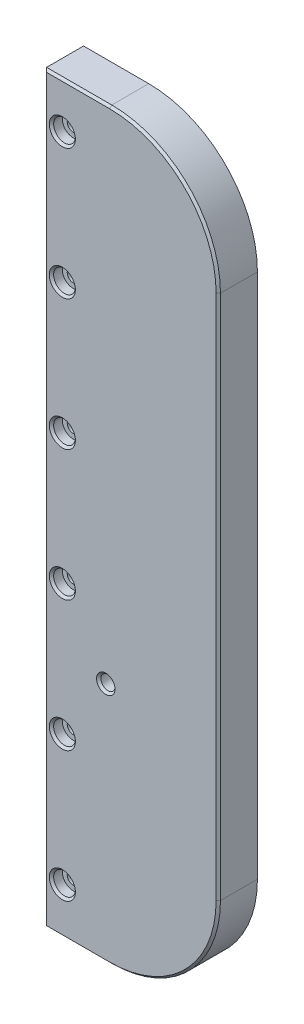
ISO-10303-21;
HEADER;
FILE_DESCRIPTION(('STEP AP214'),'2;1');
FILE_NAME('part.step','',(''),(''),'','','');
FILE_SCHEMA(('AUTOMOTIVE_DESIGN { 1 0 10303 214 1 1 1 1 }'));
ENDSEC;
DATA;
#1=APPLICATION_CONTEXT('core data for automotive mechanical design processes');
#2=APPLICATION_PROTOCOL_DEFINITION('international standard','automotive_design',2000,#1);
#3=PRODUCT_CONTEXT('',#1,'mechanical');
#4=PRODUCT('Part','Part','',(#3));
#5=PRODUCT_RELATED_PRODUCT_CATEGORY('part','',(#4));
#6=PRODUCT_DEFINITION_FORMATION('','',#4);
#7=PRODUCT_DEFINITION_CONTEXT('part definition',#1,'design');
#8=PRODUCT_DEFINITION('design','',#6,#7);
#9=PRODUCT_DEFINITION_SHAPE('','',#8);
#10=(LENGTH_UNIT() NAMED_UNIT(*) SI_UNIT(.MILLI.,.METRE.));
#11=(NAMED_UNIT(*) PLANE_ANGLE_UNIT() SI_UNIT($,.RADIAN.));
#12=(NAMED_UNIT(*) SI_UNIT($,.STERADIAN.) SOLID_ANGLE_UNIT());
#13=UNCERTAINTY_MEASURE_WITH_UNIT(LENGTH_MEASURE(1.E-05),#10,'distance_accuracy_value','');
#14=(GEOMETRIC_REPRESENTATION_CONTEXT(3) GLOBAL_UNCERTAINTY_ASSIGNED_CONTEXT((#13)) GLOBAL_UNIT_ASSIGNED_CONTEXT((#10,
#11,#12)) REPRESENTATION_CONTEXT('',''));
#15=CARTESIAN_POINT('',(0.,0.,0.));
#16=DIRECTION('',(0.,0.,1.));
#17=DIRECTION('',(1.,0.,0.));
#18=AXIS2_PLACEMENT_3D('',#15,#16,#17);
#19=CARTESIAN_POINT('',(1.00000000000003,271.,18.));
#20=DIRECTION('',(1.,0.,0.));
#21=DIRECTION('',(0.,1.,0.));
#22=AXIS2_PLACEMENT_3D('',#19,#20,#21);
#23=PLANE('',#22);
#24=DIRECTION('',(0.,0.,-1.));
#25=VECTOR('',#24,1.);
#26=CARTESIAN_POINT('',(1.00000000000007,-70.9999999999998,18.));
#27=LINE('',#26,#25);
#28=CARTESIAN_POINT('',(1.00000000000007,-70.9999999999998,17.));
#29=VERTEX_POINT('',#28);
#30=CARTESIAN_POINT('',(1.00000000000007,-70.9999999999998,0.));
#31=VERTEX_POINT('',#30);
#32=EDGE_CURVE('E109',#29,#31,#27,.T.);
#33=ORIENTED_EDGE('',*,*,#32,.F.);
#34=DIRECTION('',(0.,1.,0.));
#35=VECTOR('',#34,1.);
#36=CARTESIAN_POINT('',(1.00000000000003,271.,17.));
#37=LINE('',#36,#35);
#38=CARTESIAN_POINT('',(1.00000000000003,271.,17.));
#39=VERTEX_POINT('',#38);
#40=EDGE_CURVE('E217',#29,#39,#37,.T.);
#41=ORIENTED_EDGE('',*,*,#40,.T.);
#42=DIRECTION('',(0.,0.,-1.));
#43=VECTOR('',#42,1.);
#44=CARTESIAN_POINT('',(1.00000000000003,271.,18.));
#45=LINE('',#44,#43);
#46=CARTESIAN_POINT('',(1.00000000000003,271.,0.));
#47=VERTEX_POINT('',#46);
#48=EDGE_CURVE('E121',#39,#47,#45,.T.);
#49=ORIENTED_EDGE('',*,*,#48,.T.);
#50=DIRECTION('',(0.,-1.,0.));
#51=VECTOR('',#50,1.);
#52=CARTESIAN_POINT('',(1.00000000000003,271.,0.));
#53=LINE('',#52,#51);
#54=EDGE_CURVE('E127',#47,#31,#53,.T.);
#55=ORIENTED_EDGE('',*,*,#54,.T.);
#56=EDGE_LOOP('',(#33,#41,#49,#55));
#57=FACE_BOUND('',#56,.T.);
#58=ADVANCED_FACE('F35',(#57),#23,.F.);
#59=CARTESIAN_POINT('',(1.00000000000007,-70.9999999999998,18.));
#60=DIRECTION('',(0.,1.,0.));
#61=DIRECTION('',(0.,0.,1.));
#62=AXIS2_PLACEMENT_3D('',#59,#60,#61);
#63=PLANE('',#62);
#64=DIRECTION('',(0.,0.,-1.));
#65=VECTOR('',#64,1.);
#66=CARTESIAN_POINT('',(31.0000000000001,-70.9999999999998,18.));
#67=LINE('',#66,#65);
#68=CARTESIAN_POINT('',(31.0000000000001,-70.9999999999998,0.));
#69=VERTEX_POINT('',#68);
#70=CARTESIAN_POINT('',(31.0000000000001,-70.9999999999998,17.));
#71=VERTEX_POINT('',#70);
#72=EDGE_CURVE('E155',#69,#71,#67,.F.);
#73=ORIENTED_EDGE('',*,*,#72,.T.);
#74=DIRECTION('',(-1.,0.,0.));
#75=VECTOR('',#74,1.);
#76=CARTESIAN_POINT('',(1.00000000000007,-70.9999999999998,17.));
#77=LINE('',#76,#75);
#78=EDGE_CURVE('E116',#71,#29,#77,.T.);
#79=ORIENTED_EDGE('',*,*,#78,.T.);
#80=ORIENTED_EDGE('',*,*,#32,.T.);
#81=DIRECTION('',(1.,0.,0.));
#82=VECTOR('',#81,1.);
#83=CARTESIAN_POINT('',(1.00000000000007,-70.9999999999998,0.));
#84=LINE('',#83,#82);
#85=EDGE_CURVE('E113',#31,#69,#84,.T.);
#86=ORIENTED_EDGE('',*,*,#85,.T.);
#87=EDGE_LOOP('',(#73,#79,#80,#86));
#88=FACE_BOUND('',#87,.T.);
#89=ADVANCED_FACE('F112',(#88),#63,.F.);
#90=CARTESIAN_POINT('',(81.,271.,18.));
#91=DIRECTION('',(-1.,0.,0.));
#92=DIRECTION('',(0.,-1.,0.));
#93=AXIS2_PLACEMENT_3D('',#90,#91,#92);
#94=PLANE('',#93);
#95=DIRECTION('',(0.,0.,-1.));
#96=VECTOR('',#95,1.);
#97=CARTESIAN_POINT('',(81.,221.,18.));
#98=LINE('',#97,#96);
#99=CARTESIAN_POINT('',(81.,221.,0.));
#100=VERTEX_POINT('',#99);
#101=CARTESIAN_POINT('',(81.,221.,17.));
#102=VERTEX_POINT('',#101);
#103=EDGE_CURVE('E153',#100,#102,#98,.F.);
#104=ORIENTED_EDGE('',*,*,#103,.T.);
#105=DIRECTION('',(0.,-1.,0.));
#106=VECTOR('',#105,1.);
#107=CARTESIAN_POINT('',(81.0000000000001,-20.9999999999999,17.));
#108=LINE('',#107,#106);
#109=CARTESIAN_POINT('',(81.0000000000001,-20.9999999999999,17.));
#110=VERTEX_POINT('',#109);
#111=EDGE_CURVE('E221',#102,#110,#108,.T.);
#112=ORIENTED_EDGE('',*,*,#111,.T.);
#113=DIRECTION('',(0.,0.,-1.));
#114=VECTOR('',#113,1.);
#115=CARTESIAN_POINT('',(81.0000000000001,-20.9999999999999,18.));
#116=LINE('',#115,#114);
#117=CARTESIAN_POINT('',(81.0000000000001,-20.9999999999999,0.));
#118=VERTEX_POINT('',#117);
#119=EDGE_CURVE('E151',#110,#118,#116,.T.);
#120=ORIENTED_EDGE('',*,*,#119,.T.);
#121=DIRECTION('',(0.,1.,0.));
#122=VECTOR('',#121,1.);
#123=CARTESIAN_POINT('',(81.,271.,0.));
#124=LINE('',#123,#122);
#125=EDGE_CURVE('E131',#118,#100,#124,.T.);
#126=ORIENTED_EDGE('',*,*,#125,.T.);
#127=EDGE_LOOP('',(#104,#112,#120,#126));
#128=FACE_BOUND('',#127,.T.);
#129=ADVANCED_FACE('F313',(#128),#94,.F.);
#130=CARTESIAN_POINT('',(1.00000000000003,271.,18.));
#131=DIRECTION('',(0.,-1.,0.));
#132=DIRECTION('',(0.,0.,-1.));
#133=AXIS2_PLACEMENT_3D('',#130,#131,#132);
#134=PLANE('',#133);
#135=ORIENTED_EDGE('',*,*,#48,.F.);
#136=DIRECTION('',(1.,0.,0.));
#137=VECTOR('',#136,1.);
#138=CARTESIAN_POINT('',(31.,271.,17.));
#139=LINE('',#138,#137);
#140=CARTESIAN_POINT('',(31.,271.,17.));
#141=VERTEX_POINT('',#140);
#142=EDGE_CURVE('E59',#39,#141,#139,.T.);
#143=ORIENTED_EDGE('',*,*,#142,.T.);
#144=DIRECTION('',(0.,0.,-1.));
#145=VECTOR('',#144,1.);
#146=CARTESIAN_POINT('',(31.,271.,18.));
#147=LINE('',#146,#145);
#148=CARTESIAN_POINT('',(31.,271.,0.));
#149=VERTEX_POINT('',#148);
#150=EDGE_CURVE('E120',#141,#149,#147,.T.);
#151=ORIENTED_EDGE('',*,*,#150,.T.);
#152=DIRECTION('',(-1.,0.,0.));
#153=VECTOR('',#152,1.);
#154=CARTESIAN_POINT('',(1.00000000000003,271.,0.));
#155=LINE('',#154,#153);
#156=EDGE_CURVE('E144',#149,#47,#155,.T.);
#157=ORIENTED_EDGE('',*,*,#156,.T.);
#158=EDGE_LOOP('',(#135,#143,#151,#157));
#159=FACE_BOUND('',#158,.T.);
#160=ADVANCED_FACE('F574',(#159),#134,.F.);
#161=CARTESIAN_POINT('',(0.,0.,18.));
#162=DIRECTION('',(0.,0.,1.));
#163=DIRECTION('',(1.,0.,0.));
#164=AXIS2_PLACEMENT_3D('',#161,#162,#163);
#165=PLANE('',#164);
#166=CARTESIAN_POINT('',(29.2499999999996,40.0000000000003,18.));
#167=DIRECTION('',(0.,0.,1.));
#168=DIRECTION('',(1.,0.,0.));
#169=AXIS2_PLACEMENT_3D('',#166,#167,#168);
#170=CIRCLE('',#169,4.25000000000006);
#171=CARTESIAN_POINT('',(33.4999999999997,40.0000000000003,18.));
#172=VERTEX_POINT('',#171);
#173=EDGE_CURVE('E11',#172,#172,#170,.F.);
#174=ORIENTED_EDGE('',*,*,#173,.T.);
#175=EDGE_LOOP('',(#174));
#176=FACE_BOUND('',#175,.T.);
#177=DIRECTION('',(1.,0.,0.));
#178=VECTOR('',#177,1.);
#179=CARTESIAN_POINT('',(31.0000000000001,-69.9999999999998,18.));
#180=LINE('',#179,#178);
#181=CARTESIAN_POINT('',(2.00000000000007,-69.9999999999998,18.));
#182=VERTEX_POINT('',#181);
#183=CARTESIAN_POINT('',(31.0000000000001,-69.9999999999998,18.));
#184=VERTEX_POINT('',#183);
#185=EDGE_CURVE('E208',#182,#184,#180,.T.);
#186=ORIENTED_EDGE('',*,*,#185,.T.);
#187=CARTESIAN_POINT('',(31.0000000000001,-20.9999999999999,18.));
#188=DIRECTION('',(0.,0.,1.));
#189=DIRECTION('',(1.,0.,0.));
#190=AXIS2_PLACEMENT_3D('',#187,#188,#189);
#191=CIRCLE('',#190,49.);
#192=CARTESIAN_POINT('',(80.0000000000001,-20.9999999999999,18.));
#193=VERTEX_POINT('',#192);
#194=EDGE_CURVE('E210',#184,#193,#191,.T.);
#195=ORIENTED_EDGE('',*,*,#194,.T.);
#196=DIRECTION('',(0.,1.,0.));
#197=VECTOR('',#196,1.);
#198=CARTESIAN_POINT('',(80.,221.,18.));
#199=LINE('',#198,#197);
#200=CARTESIAN_POINT('',(80.,221.,18.));
#201=VERTEX_POINT('',#200);
#202=EDGE_CURVE('E200',#193,#201,#199,.T.);
#203=ORIENTED_EDGE('',*,*,#202,.T.);
#204=CARTESIAN_POINT('',(31.,221.,18.));
#205=DIRECTION('',(0.,0.,1.));
#206=DIRECTION('',(1.,0.,0.));
#207=AXIS2_PLACEMENT_3D('',#204,#205,#206);
#208=CIRCLE('',#207,49.);
#209=CARTESIAN_POINT('',(31.,270.,18.));
#210=VERTEX_POINT('',#209);
#211=EDGE_CURVE('E202',#201,#210,#208,.T.);
#212=ORIENTED_EDGE('',*,*,#211,.T.);
#213=DIRECTION('',(-1.,0.,0.));
#214=VECTOR('',#213,1.);
#215=CARTESIAN_POINT('',(1.00000000000003,270.,18.));
#216=LINE('',#215,#214);
#217=CARTESIAN_POINT('',(2.00000000000003,270.,18.));
#218=VERTEX_POINT('',#217);
#219=EDGE_CURVE('E204',#210,#218,#216,.T.);
#220=ORIENTED_EDGE('',*,*,#219,.T.);
#221=DIRECTION('',(0.,-1.,0.));
#222=VECTOR('',#221,1.);
#223=CARTESIAN_POINT('',(2.00000000000007,-70.9999999999998,18.));
#224=LINE('',#223,#222);
#225=EDGE_CURVE('E206',#218,#182,#224,.T.);
#226=ORIENTED_EDGE('',*,*,#225,.T.);
#227=EDGE_LOOP('',(#186,#195,#203,#212,#220,#226));
#228=FACE_BOUND('',#227,.T.);
#229=CARTESIAN_POINT('',(9.25000000000003,-49.9999999999997,18.));
#230=DIRECTION('',(0.,0.,1.));
#231=DIRECTION('',(1.,0.,0.));
#232=AXIS2_PLACEMENT_3D('',#229,#230,#231);
#233=CIRCLE('',#232,5.99999999999998);
#234=CARTESIAN_POINT('',(15.25,-49.9999999999997,18.));
#235=VERTEX_POINT('',#234);
#236=EDGE_CURVE('E197',#235,#235,#233,.F.);
#237=ORIENTED_EDGE('',*,*,#236,.T.);
#238=EDGE_LOOP('',(#237));
#239=FACE_BOUND('',#238,.T.);
#240=CARTESIAN_POINT('',(9.24999999999982,10.0000000000003,18.));
#241=DIRECTION('',(0.,0.,1.));
#242=DIRECTION('',(1.,0.,0.));
#243=AXIS2_PLACEMENT_3D('',#240,#241,#242);
#244=CIRCLE('',#243,5.99999999999998);
#245=CARTESIAN_POINT('',(15.2499999999998,10.0000000000003,18.));
#246=VERTEX_POINT('',#245);
#247=EDGE_CURVE('E194',#246,#246,#244,.F.);
#248=ORIENTED_EDGE('',*,*,#247,.T.);
#249=EDGE_LOOP('',(#248));
#250=FACE_BOUND('',#249,.T.);
#251=CARTESIAN_POINT('',(9.24999999999962,70.0000000000003,18.));
#252=DIRECTION('',(0.,0.,1.));
#253=DIRECTION('',(1.,0.,0.));
#254=AXIS2_PLACEMENT_3D('',#251,#252,#253);
#255=CIRCLE('',#254,5.99999999999998);
#256=CARTESIAN_POINT('',(15.2499999999996,70.0000000000003,18.));
#257=VERTEX_POINT('',#256);
#258=EDGE_CURVE('E191',#257,#257,#255,.F.);
#259=ORIENTED_EDGE('',*,*,#258,.T.);
#260=EDGE_LOOP('',(#259));
#261=FACE_BOUND('',#260,.T.);
#262=CARTESIAN_POINT('',(9.24999999999941,130.,18.));
#263=DIRECTION('',(0.,0.,1.));
#264=DIRECTION('',(1.,0.,0.));
#265=AXIS2_PLACEMENT_3D('',#262,#263,#264);
#266=CIRCLE('',#265,5.99999999999998);
#267=CARTESIAN_POINT('',(15.2499999999994,130.,18.));
#268=VERTEX_POINT('',#267);
#269=EDGE_CURVE('E188',#268,#268,#266,.F.);
#270=ORIENTED_EDGE('',*,*,#269,.T.);
#271=EDGE_LOOP('',(#270));
#272=FACE_BOUND('',#271,.T.);
#273=CARTESIAN_POINT('',(9.2499999999992,190.,18.));
#274=DIRECTION('',(0.,0.,1.));
#275=DIRECTION('',(1.,0.,0.));
#276=AXIS2_PLACEMENT_3D('',#273,#274,#275);
#277=CIRCLE('',#276,5.99999999999998);
#278=CARTESIAN_POINT('',(15.2499999999992,190.,18.));
#279=VERTEX_POINT('',#278);
#280=EDGE_CURVE('E185',#279,#279,#277,.F.);
#281=ORIENTED_EDGE('',*,*,#280,.T.);
#282=EDGE_LOOP('',(#281));
#283=FACE_BOUND('',#282,.T.);
#284=CARTESIAN_POINT('',(9.249999999999,250.,18.));
#285=DIRECTION('',(0.,0.,1.));
#286=DIRECTION('',(1.,0.,0.));
#287=AXIS2_PLACEMENT_3D('',#284,#285,#286);
#288=CIRCLE('',#287,5.99999999999998);
#289=CARTESIAN_POINT('',(15.249999999999,250.,18.));
#290=VERTEX_POINT('',#289);
#291=EDGE_CURVE('E156',#290,#290,#288,.F.);
#292=ORIENTED_EDGE('',*,*,#291,.T.);
#293=EDGE_LOOP('',(#292));
#294=FACE_BOUND('',#293,.T.);
#295=ADVANCED_FACE('F277',(#176,#228,#239,#250,#261,#272,#283,#294),#165,.T.);
#296=CARTESIAN_POINT('',(0.,0.,0.));
#297=DIRECTION('',(0.,0.,1.));
#298=DIRECTION('',(1.,0.,0.));
#299=AXIS2_PLACEMENT_3D('',#296,#297,#298);
#300=PLANE('',#299);
#301=CARTESIAN_POINT('',(29.2499999999996,40.0000000000003,0.));
#302=DIRECTION('',(0.,0.,1.));
#303=DIRECTION('',(1.,0.,0.));
#304=AXIS2_PLACEMENT_3D('',#301,#302,#303);
#305=CIRCLE('',#304,4.24999999999998);
#306=CARTESIAN_POINT('',(33.4999999999996,40.0000000000003,0.));
#307=VERTEX_POINT('',#306);
#308=EDGE_CURVE('E241',#307,#307,#305,.T.);
#309=ORIENTED_EDGE('',*,*,#308,.T.);
#310=EDGE_LOOP('',(#309));
#311=FACE_BOUND('',#310,.T.);
#312=CARTESIAN_POINT('',(9.249999999999,250.,0.));
#313=DIRECTION('',(0.,0.,1.));
#314=DIRECTION('',(1.,0.,0.));
#315=AXIS2_PLACEMENT_3D('',#312,#313,#314);
#316=CIRCLE('',#315,2.74999999999999);
#317=CARTESIAN_POINT('',(11.999999999999,250.,0.));
#318=VERTEX_POINT('',#317);
#319=EDGE_CURVE('E178',#318,#318,#316,.T.);
#320=ORIENTED_EDGE('',*,*,#319,.T.);
#321=EDGE_LOOP('',(#320));
#322=FACE_BOUND('',#321,.T.);
#323=CARTESIAN_POINT('',(9.2499999999992,190.,0.));
#324=DIRECTION('',(0.,0.,1.));
#325=DIRECTION('',(1.,0.,0.));
#326=AXIS2_PLACEMENT_3D('',#323,#324,#325);
#327=CIRCLE('',#326,2.74999999999999);
#328=CARTESIAN_POINT('',(11.9999999999992,190.,0.));
#329=VERTEX_POINT('',#328);
#330=EDGE_CURVE('E173',#329,#329,#327,.T.);
#331=ORIENTED_EDGE('',*,*,#330,.T.);
#332=EDGE_LOOP('',(#331));
#333=FACE_BOUND('',#332,.T.);
#334=CARTESIAN_POINT('',(9.24999999999941,130.,0.));
#335=DIRECTION('',(0.,0.,1.));
#336=DIRECTION('',(1.,0.,0.));
#337=AXIS2_PLACEMENT_3D('',#334,#335,#336);
#338=CIRCLE('',#337,2.74999999999999);
#339=CARTESIAN_POINT('',(11.9999999999994,130.,0.));
#340=VERTEX_POINT('',#339);
#341=EDGE_CURVE('E168',#340,#340,#338,.T.);
#342=ORIENTED_EDGE('',*,*,#341,.T.);
#343=EDGE_LOOP('',(#342));
#344=FACE_BOUND('',#343,.T.);
#345=CARTESIAN_POINT('',(9.24999999999962,70.0000000000003,0.));
#346=DIRECTION('',(0.,0.,1.));
#347=DIRECTION('',(1.,0.,0.));
#348=AXIS2_PLACEMENT_3D('',#345,#346,#347);
#349=CIRCLE('',#348,2.74999999999999);
#350=CARTESIAN_POINT('',(11.9999999999996,70.0000000000003,0.));
#351=VERTEX_POINT('',#350);
#352=EDGE_CURVE('E163',#351,#351,#349,.T.);
#353=ORIENTED_EDGE('',*,*,#352,.T.);
#354=EDGE_LOOP('',(#353));
#355=FACE_BOUND('',#354,.T.);
#356=CARTESIAN_POINT('',(9.24999999999982,10.0000000000003,0.));
#357=DIRECTION('',(0.,0.,1.));
#358=DIRECTION('',(1.,0.,0.));
#359=AXIS2_PLACEMENT_3D('',#356,#357,#358);
#360=CIRCLE('',#359,2.74999999999999);
#361=CARTESIAN_POINT('',(11.9999999999998,10.0000000000003,0.));
#362=VERTEX_POINT('',#361);
#363=EDGE_CURVE('E158',#362,#362,#360,.T.);
#364=ORIENTED_EDGE('',*,*,#363,.T.);
#365=EDGE_LOOP('',(#364));
#366=FACE_BOUND('',#365,.T.);
#367=CARTESIAN_POINT('',(9.25000000000003,-49.9999999999997,0.));
#368=DIRECTION('',(0.,0.,1.));
#369=DIRECTION('',(1.,0.,0.));
#370=AXIS2_PLACEMENT_3D('',#367,#368,#369);
#371=CIRCLE('',#370,2.74999999999999);
#372=CARTESIAN_POINT('',(12.,-49.9999999999997,0.));
#373=VERTEX_POINT('',#372);
#374=EDGE_CURVE('E134',#373,#373,#371,.T.);
#375=ORIENTED_EDGE('',*,*,#374,.T.);
#376=EDGE_LOOP('',(#375));
#377=FACE_BOUND('',#376,.T.);
#378=ORIENTED_EDGE('',*,*,#156,.F.);
#379=CARTESIAN_POINT('',(31.,221.,0.));
#380=DIRECTION('',(0.,0.,1.));
#381=DIRECTION('',(1.,0.,0.));
#382=AXIS2_PLACEMENT_3D('',#379,#380,#381);
#383=CIRCLE('',#382,50.);
#384=EDGE_CURVE('E149',#149,#100,#383,.F.);
#385=ORIENTED_EDGE('',*,*,#384,.T.);
#386=ORIENTED_EDGE('',*,*,#125,.F.);
#387=CARTESIAN_POINT('',(31.0000000000001,-20.9999999999999,0.));
#388=DIRECTION('',(0.,0.,1.));
#389=DIRECTION('',(1.,0.,0.));
#390=AXIS2_PLACEMENT_3D('',#387,#388,#389);
#391=CIRCLE('',#390,50.);
#392=EDGE_CURVE('E130',#118,#69,#391,.F.);
#393=ORIENTED_EDGE('',*,*,#392,.T.);
#394=ORIENTED_EDGE('',*,*,#85,.F.);
#395=ORIENTED_EDGE('',*,*,#54,.F.);
#396=EDGE_LOOP('',(#378,#385,#386,#393,#394,#395));
#397=FACE_BOUND('',#396,.T.);
#398=ADVANCED_FACE('F126',(#311,#322,#333,#344,#355,#366,#377,#397),#300,.F.);
#399=CARTESIAN_POINT('',(31.,221.,18.));
#400=DIRECTION('',(0.,0.,-1.));
#401=DIRECTION('',(-1.,0.,0.));
#402=AXIS2_PLACEMENT_3D('',#399,#400,#401);
#403=CYLINDRICAL_SURFACE('',#402,50.);
#404=ORIENTED_EDGE('',*,*,#150,.F.);
#405=CARTESIAN_POINT('',(31.,221.,17.));
#406=DIRECTION('',(0.,0.,1.));
#407=DIRECTION('',(1.,0.,0.));
#408=AXIS2_PLACEMENT_3D('',#405,#406,#407);
#409=CIRCLE('',#408,50.);
#410=EDGE_CURVE('E51',#141,#102,#409,.F.);
#411=ORIENTED_EDGE('',*,*,#410,.T.);
#412=ORIENTED_EDGE('',*,*,#103,.F.);
#413=ORIENTED_EDGE('',*,*,#384,.F.);
#414=EDGE_LOOP('',(#404,#411,#412,#413));
#415=FACE_BOUND('',#414,.T.);
#416=ADVANCED_FACE('F276',(#415),#403,.T.);
#417=CARTESIAN_POINT('',(31.0000000000001,-20.9999999999999,18.));
#418=DIRECTION('',(0.,0.,-1.));
#419=DIRECTION('',(-1.,0.,0.));
#420=AXIS2_PLACEMENT_3D('',#417,#418,#419);
#421=CYLINDRICAL_SURFACE('',#420,50.);
#422=ORIENTED_EDGE('',*,*,#119,.F.);
#423=CARTESIAN_POINT('',(31.0000000000001,-20.9999999999999,17.));
#424=DIRECTION('',(0.,0.,1.));
#425=DIRECTION('',(1.,0.,0.));
#426=AXIS2_PLACEMENT_3D('',#423,#424,#425);
#427=CIRCLE('',#426,50.);
#428=EDGE_CURVE('E213',#110,#71,#427,.F.);
#429=ORIENTED_EDGE('',*,*,#428,.T.);
#430=ORIENTED_EDGE('',*,*,#72,.F.);
#431=ORIENTED_EDGE('',*,*,#392,.F.);
#432=EDGE_LOOP('',(#422,#429,#430,#431));
#433=FACE_BOUND('',#432,.T.);
#434=ADVANCED_FACE('F294',(#433),#421,.T.);
#435=CARTESIAN_POINT('',(9.25000000000003,-49.9999999999997,18.));
#436=DIRECTION('',(0.,0.,1.));
#437=DIRECTION('',(1.,0.,0.));
#438=AXIS2_PLACEMENT_3D('',#435,#436,#437);
#439=CYLINDRICAL_SURFACE('',#438,2.74999999999999);
#440=CARTESIAN_POINT('',(9.25000000000003,-49.9999999999997,13.));
#441=DIRECTION('',(0.,0.,1.));
#442=DIRECTION('',(1.,0.,0.));
#443=AXIS2_PLACEMENT_3D('',#440,#441,#442);
#444=CIRCLE('',#443,2.75);
#445=CARTESIAN_POINT('',(12.,-49.9999999999997,13.));
#446=VERTEX_POINT('',#445);
#447=EDGE_CURVE('E137',#446,#446,#444,.T.);
#448=ORIENTED_EDGE('',*,*,#447,.T.);
#449=EDGE_LOOP('',(#448));
#450=FACE_BOUND('',#449,.T.);
#451=ORIENTED_EDGE('',*,*,#374,.F.);
#452=EDGE_LOOP('',(#451));
#453=FACE_BOUND('',#452,.T.);
#454=ADVANCED_FACE('F291',(#450,#453),#439,.F.);
#455=CARTESIAN_POINT('',(12.,-49.9999999999997,13.));
#456=DIRECTION('',(0.,0.,-1.));
#457=DIRECTION('',(-1.,0.,0.));
#458=AXIS2_PLACEMENT_3D('',#455,#456,#457);
#459=PLANE('',#458);
#460=ORIENTED_EDGE('',*,*,#447,.F.);
#461=EDGE_LOOP('',(#460));
#462=FACE_BOUND('',#461,.T.);
#463=CARTESIAN_POINT('',(9.25000000000003,-49.9999999999997,13.));
#464=DIRECTION('',(0.,0.,1.));
#465=DIRECTION('',(1.,0.,0.));
#466=AXIS2_PLACEMENT_3D('',#463,#464,#465);
#467=CIRCLE('',#466,5.);
#468=CARTESIAN_POINT('',(14.25,-49.9999999999997,13.));
#469=VERTEX_POINT('',#468);
#470=EDGE_CURVE('E161',#469,#469,#467,.T.);
#471=ORIENTED_EDGE('',*,*,#470,.T.);
#472=EDGE_LOOP('',(#471));
#473=FACE_BOUND('',#472,.T.);
#474=ADVANCED_FACE('F293',(#462,#473),#459,.F.);
#475=CARTESIAN_POINT('',(9.25000000000003,-49.9999999999997,18.));
#476=DIRECTION('',(0.,0.,1.));
#477=DIRECTION('',(1.,0.,0.));
#478=AXIS2_PLACEMENT_3D('',#475,#476,#477);
#479=CYLINDRICAL_SURFACE('',#478,5.);
#480=CARTESIAN_POINT('',(9.25000000000003,-49.9999999999997,17.));
#481=DIRECTION('',(0.,0.,1.));
#482=DIRECTION('',(1.,0.,0.));
#483=AXIS2_PLACEMENT_3D('',#480,#481,#482);
#484=CIRCLE('',#483,5.);
#485=CARTESIAN_POINT('',(14.25,-49.9999999999997,17.));
#486=VERTEX_POINT('',#485);
#487=EDGE_CURVE('E223',#486,#486,#484,.T.);
#488=ORIENTED_EDGE('',*,*,#487,.T.);
#489=EDGE_LOOP('',(#488));
#490=FACE_BOUND('',#489,.T.);
#491=ORIENTED_EDGE('',*,*,#470,.F.);
#492=EDGE_LOOP('',(#491));
#493=FACE_BOUND('',#492,.T.);
#494=ADVANCED_FACE('F301',(#490,#493),#479,.F.);
#495=CARTESIAN_POINT('',(9.24999999999982,10.0000000000003,18.));
#496=DIRECTION('',(0.,0.,1.));
#497=DIRECTION('',(1.,0.,0.));
#498=AXIS2_PLACEMENT_3D('',#495,#496,#497);
#499=CYLINDRICAL_SURFACE('',#498,2.74999999999999);
#500=CARTESIAN_POINT('',(9.24999999999982,10.0000000000003,13.));
#501=DIRECTION('',(0.,0.,1.));
#502=DIRECTION('',(1.,0.,0.));
#503=AXIS2_PLACEMENT_3D('',#500,#501,#502);
#504=CIRCLE('',#503,2.75);
#505=CARTESIAN_POINT('',(11.9999999999998,10.0000000000003,13.));
#506=VERTEX_POINT('',#505);
#507=EDGE_CURVE('E162',#506,#506,#504,.T.);
#508=ORIENTED_EDGE('',*,*,#507,.T.);
#509=EDGE_LOOP('',(#508));
#510=FACE_BOUND('',#509,.T.);
#511=ORIENTED_EDGE('',*,*,#363,.F.);
#512=EDGE_LOOP('',(#511));
#513=FACE_BOUND('',#512,.T.);
#514=ADVANCED_FACE('F448',(#510,#513),#499,.F.);
#515=CARTESIAN_POINT('',(11.9999999999998,10.0000000000003,13.));
#516=DIRECTION('',(0.,0.,-1.));
#517=DIRECTION('',(-1.,0.,0.));
#518=AXIS2_PLACEMENT_3D('',#515,#516,#517);
#519=PLANE('',#518);
#520=ORIENTED_EDGE('',*,*,#507,.F.);
#521=EDGE_LOOP('',(#520));
#522=FACE_BOUND('',#521,.T.);
#523=CARTESIAN_POINT('',(9.24999999999982,10.0000000000003,13.));
#524=DIRECTION('',(0.,0.,1.));
#525=DIRECTION('',(1.,0.,0.));
#526=AXIS2_PLACEMENT_3D('',#523,#524,#525);
#527=CIRCLE('',#526,5.);
#528=CARTESIAN_POINT('',(14.2499999999998,10.0000000000003,13.));
#529=VERTEX_POINT('',#528);
#530=EDGE_CURVE('E166',#529,#529,#527,.T.);
#531=ORIENTED_EDGE('',*,*,#530,.T.);
#532=EDGE_LOOP('',(#531));
#533=FACE_BOUND('',#532,.T.);
#534=ADVANCED_FACE('F454',(#522,#533),#519,.F.);
#535=CARTESIAN_POINT('',(9.24999999999982,10.0000000000003,18.));
#536=DIRECTION('',(0.,0.,1.));
#537=DIRECTION('',(1.,0.,0.));
#538=AXIS2_PLACEMENT_3D('',#535,#536,#537);
#539=CYLINDRICAL_SURFACE('',#538,5.);
#540=CARTESIAN_POINT('',(9.24999999999982,10.0000000000003,17.));
#541=DIRECTION('',(0.,0.,1.));
#542=DIRECTION('',(1.,0.,0.));
#543=AXIS2_PLACEMENT_3D('',#540,#541,#542);
#544=CIRCLE('',#543,5.);
#545=CARTESIAN_POINT('',(14.2499999999998,10.0000000000003,17.));
#546=VERTEX_POINT('',#545);
#547=EDGE_CURVE('E226',#546,#546,#544,.T.);
#548=ORIENTED_EDGE('',*,*,#547,.T.);
#549=EDGE_LOOP('',(#548));
#550=FACE_BOUND('',#549,.T.);
#551=ORIENTED_EDGE('',*,*,#530,.F.);
#552=EDGE_LOOP('',(#551));
#553=FACE_BOUND('',#552,.T.);
#554=ADVANCED_FACE('F460',(#550,#553),#539,.F.);
#555=CARTESIAN_POINT('',(9.24999999999962,70.0000000000003,18.));
#556=DIRECTION('',(0.,0.,1.));
#557=DIRECTION('',(1.,0.,0.));
#558=AXIS2_PLACEMENT_3D('',#555,#556,#557);
#559=CYLINDRICAL_SURFACE('',#558,2.74999999999999);
#560=CARTESIAN_POINT('',(9.24999999999962,70.0000000000003,13.));
#561=DIRECTION('',(0.,0.,1.));
#562=DIRECTION('',(1.,0.,0.));
#563=AXIS2_PLACEMENT_3D('',#560,#561,#562);
#564=CIRCLE('',#563,2.75);
#565=CARTESIAN_POINT('',(11.9999999999996,70.0000000000003,13.));
#566=VERTEX_POINT('',#565);
#567=EDGE_CURVE('E167',#566,#566,#564,.T.);
#568=ORIENTED_EDGE('',*,*,#567,.T.);
#569=EDGE_LOOP('',(#568));
#570=FACE_BOUND('',#569,.T.);
#571=ORIENTED_EDGE('',*,*,#352,.F.);
#572=EDGE_LOOP('',(#571));
#573=FACE_BOUND('',#572,.T.);
#574=ADVANCED_FACE('F464',(#570,#573),#559,.F.);
#575=CARTESIAN_POINT('',(11.9999999999996,70.0000000000003,13.));
#576=DIRECTION('',(0.,0.,-1.));
#577=DIRECTION('',(-1.,0.,0.));
#578=AXIS2_PLACEMENT_3D('',#575,#576,#577);
#579=PLANE('',#578);
#580=ORIENTED_EDGE('',*,*,#567,.F.);
#581=EDGE_LOOP('',(#580));
#582=FACE_BOUND('',#581,.T.);
#583=CARTESIAN_POINT('',(9.24999999999962,70.0000000000003,13.));
#584=DIRECTION('',(0.,0.,1.));
#585=DIRECTION('',(1.,0.,0.));
#586=AXIS2_PLACEMENT_3D('',#583,#584,#585);
#587=CIRCLE('',#586,5.);
#588=CARTESIAN_POINT('',(14.2499999999996,70.0000000000003,13.));
#589=VERTEX_POINT('',#588);
#590=EDGE_CURVE('E171',#589,#589,#587,.T.);
#591=ORIENTED_EDGE('',*,*,#590,.T.);
#592=EDGE_LOOP('',(#591));
#593=FACE_BOUND('',#592,.T.);
#594=ADVANCED_FACE('F468',(#582,#593),#579,.F.);
#595=CARTESIAN_POINT('',(9.24999999999962,70.0000000000003,18.));
#596=DIRECTION('',(0.,0.,1.));
#597=DIRECTION('',(1.,0.,0.));
#598=AXIS2_PLACEMENT_3D('',#595,#596,#597);
#599=CYLINDRICAL_SURFACE('',#598,5.);
#600=CARTESIAN_POINT('',(9.24999999999962,70.0000000000003,17.));
#601=DIRECTION('',(0.,0.,1.));
#602=DIRECTION('',(1.,0.,0.));
#603=AXIS2_PLACEMENT_3D('',#600,#601,#602);
#604=CIRCLE('',#603,5.);
#605=CARTESIAN_POINT('',(14.2499999999996,70.0000000000003,17.));
#606=VERTEX_POINT('',#605);
#607=EDGE_CURVE('E229',#606,#606,#604,.T.);
#608=ORIENTED_EDGE('',*,*,#607,.T.);
#609=EDGE_LOOP('',(#608));
#610=FACE_BOUND('',#609,.T.);
#611=ORIENTED_EDGE('',*,*,#590,.F.);
#612=EDGE_LOOP('',(#611));
#613=FACE_BOUND('',#612,.T.);
#614=ADVANCED_FACE('F472',(#610,#613),#599,.F.);
#615=CARTESIAN_POINT('',(9.24999999999941,130.,18.));
#616=DIRECTION('',(0.,0.,1.));
#617=DIRECTION('',(1.,0.,0.));
#618=AXIS2_PLACEMENT_3D('',#615,#616,#617);
#619=CYLINDRICAL_SURFACE('',#618,2.74999999999999);
#620=CARTESIAN_POINT('',(9.24999999999941,130.,13.));
#621=DIRECTION('',(0.,0.,1.));
#622=DIRECTION('',(1.,0.,0.));
#623=AXIS2_PLACEMENT_3D('',#620,#621,#622);
#624=CIRCLE('',#623,2.75);
#625=CARTESIAN_POINT('',(11.9999999999994,130.,13.));
#626=VERTEX_POINT('',#625);
#627=EDGE_CURVE('E172',#626,#626,#624,.T.);
#628=ORIENTED_EDGE('',*,*,#627,.T.);
#629=EDGE_LOOP('',(#628));
#630=FACE_BOUND('',#629,.T.);
#631=ORIENTED_EDGE('',*,*,#341,.F.);
#632=EDGE_LOOP('',(#631));
#633=FACE_BOUND('',#632,.T.);
#634=ADVANCED_FACE('F476',(#630,#633),#619,.F.);
#635=CARTESIAN_POINT('',(11.9999999999994,130.,13.));
#636=DIRECTION('',(0.,0.,-1.));
#637=DIRECTION('',(-1.,0.,0.));
#638=AXIS2_PLACEMENT_3D('',#635,#636,#637);
#639=PLANE('',#638);
#640=ORIENTED_EDGE('',*,*,#627,.F.);
#641=EDGE_LOOP('',(#640));
#642=FACE_BOUND('',#641,.T.);
#643=CARTESIAN_POINT('',(9.24999999999941,130.,13.));
#644=DIRECTION('',(0.,0.,1.));
#645=DIRECTION('',(1.,0.,0.));
#646=AXIS2_PLACEMENT_3D('',#643,#644,#645);
#647=CIRCLE('',#646,5.);
#648=CARTESIAN_POINT('',(14.2499999999994,130.,13.));
#649=VERTEX_POINT('',#648);
#650=EDGE_CURVE('E176',#649,#649,#647,.T.);
#651=ORIENTED_EDGE('',*,*,#650,.T.);
#652=EDGE_LOOP('',(#651));
#653=FACE_BOUND('',#652,.T.);
#654=ADVANCED_FACE('F480',(#642,#653),#639,.F.);
#655=CARTESIAN_POINT('',(9.24999999999941,130.,18.));
#656=DIRECTION('',(0.,0.,1.));
#657=DIRECTION('',(1.,0.,0.));
#658=AXIS2_PLACEMENT_3D('',#655,#656,#657);
#659=CYLINDRICAL_SURFACE('',#658,5.);
#660=CARTESIAN_POINT('',(9.24999999999941,130.,17.));
#661=DIRECTION('',(0.,0.,1.));
#662=DIRECTION('',(1.,0.,0.));
#663=AXIS2_PLACEMENT_3D('',#660,#661,#662);
#664=CIRCLE('',#663,5.);
#665=CARTESIAN_POINT('',(14.2499999999994,130.,17.));
#666=VERTEX_POINT('',#665);
#667=EDGE_CURVE('E232',#666,#666,#664,.T.);
#668=ORIENTED_EDGE('',*,*,#667,.T.);
#669=EDGE_LOOP('',(#668));
#670=FACE_BOUND('',#669,.T.);
#671=ORIENTED_EDGE('',*,*,#650,.F.);
#672=EDGE_LOOP('',(#671));
#673=FACE_BOUND('',#672,.T.);
#674=ADVANCED_FACE('F484',(#670,#673),#659,.F.);
#675=CARTESIAN_POINT('',(9.2499999999992,190.,18.));
#676=DIRECTION('',(0.,0.,1.));
#677=DIRECTION('',(1.,0.,0.));
#678=AXIS2_PLACEMENT_3D('',#675,#676,#677);
#679=CYLINDRICAL_SURFACE('',#678,2.74999999999999);
#680=CARTESIAN_POINT('',(9.2499999999992,190.,13.));
#681=DIRECTION('',(0.,0.,1.));
#682=DIRECTION('',(1.,0.,0.));
#683=AXIS2_PLACEMENT_3D('',#680,#681,#682);
#684=CIRCLE('',#683,2.75);
#685=CARTESIAN_POINT('',(11.9999999999992,190.,13.));
#686=VERTEX_POINT('',#685);
#687=EDGE_CURVE('E177',#686,#686,#684,.T.);
#688=ORIENTED_EDGE('',*,*,#687,.T.);
#689=EDGE_LOOP('',(#688));
#690=FACE_BOUND('',#689,.T.);
#691=ORIENTED_EDGE('',*,*,#330,.F.);
#692=EDGE_LOOP('',(#691));
#693=FACE_BOUND('',#692,.T.);
#694=ADVANCED_FACE('F488',(#690,#693),#679,.F.);
#695=CARTESIAN_POINT('',(11.9999999999992,190.,13.));
#696=DIRECTION('',(0.,0.,-1.));
#697=DIRECTION('',(-1.,0.,0.));
#698=AXIS2_PLACEMENT_3D('',#695,#696,#697);
#699=PLANE('',#698);
#700=ORIENTED_EDGE('',*,*,#687,.F.);
#701=EDGE_LOOP('',(#700));
#702=FACE_BOUND('',#701,.T.);
#703=CARTESIAN_POINT('',(9.2499999999992,190.,13.));
#704=DIRECTION('',(0.,0.,1.));
#705=DIRECTION('',(1.,0.,0.));
#706=AXIS2_PLACEMENT_3D('',#703,#704,#705);
#707=CIRCLE('',#706,5.);
#708=CARTESIAN_POINT('',(14.2499999999992,190.,13.));
#709=VERTEX_POINT('',#708);
#710=EDGE_CURVE('E181',#709,#709,#707,.T.);
#711=ORIENTED_EDGE('',*,*,#710,.T.);
#712=EDGE_LOOP('',(#711));
#713=FACE_BOUND('',#712,.T.);
#714=ADVANCED_FACE('F492',(#702,#713),#699,.F.);
#715=CARTESIAN_POINT('',(9.2499999999992,190.,18.));
#716=DIRECTION('',(0.,0.,1.));
#717=DIRECTION('',(1.,0.,0.));
#718=AXIS2_PLACEMENT_3D('',#715,#716,#717);
#719=CYLINDRICAL_SURFACE('',#718,5.);
#720=CARTESIAN_POINT('',(9.2499999999992,190.,17.));
#721=DIRECTION('',(0.,0.,1.));
#722=DIRECTION('',(1.,0.,0.));
#723=AXIS2_PLACEMENT_3D('',#720,#721,#722);
#724=CIRCLE('',#723,5.);
#725=CARTESIAN_POINT('',(14.2499999999992,190.,17.));
#726=VERTEX_POINT('',#725);
#727=EDGE_CURVE('E235',#726,#726,#724,.T.);
#728=ORIENTED_EDGE('',*,*,#727,.T.);
#729=EDGE_LOOP('',(#728));
#730=FACE_BOUND('',#729,.T.);
#731=ORIENTED_EDGE('',*,*,#710,.F.);
#732=EDGE_LOOP('',(#731));
#733=FACE_BOUND('',#732,.T.);
#734=ADVANCED_FACE('F496',(#730,#733),#719,.F.);
#735=CARTESIAN_POINT('',(9.249999999999,250.,18.));
#736=DIRECTION('',(0.,0.,1.));
#737=DIRECTION('',(1.,0.,0.));
#738=AXIS2_PLACEMENT_3D('',#735,#736,#737);
#739=CYLINDRICAL_SURFACE('',#738,2.74999999999999);
#740=CARTESIAN_POINT('',(9.249999999999,250.,13.));
#741=DIRECTION('',(0.,0.,1.));
#742=DIRECTION('',(1.,0.,0.));
#743=AXIS2_PLACEMENT_3D('',#740,#741,#742);
#744=CIRCLE('',#743,2.75);
#745=CARTESIAN_POINT('',(11.999999999999,250.,13.));
#746=VERTEX_POINT('',#745);
#747=EDGE_CURVE('E182',#746,#746,#744,.T.);
#748=ORIENTED_EDGE('',*,*,#747,.T.);
#749=EDGE_LOOP('',(#748));
#750=FACE_BOUND('',#749,.T.);
#751=ORIENTED_EDGE('',*,*,#319,.F.);
#752=EDGE_LOOP('',(#751));
#753=FACE_BOUND('',#752,.T.);
#754=ADVANCED_FACE('F500',(#750,#753),#739,.F.);
#755=CARTESIAN_POINT('',(11.999999999999,250.,13.));
#756=DIRECTION('',(0.,0.,-1.));
#757=DIRECTION('',(-1.,0.,0.));
#758=AXIS2_PLACEMENT_3D('',#755,#756,#757);
#759=PLANE('',#758);
#760=ORIENTED_EDGE('',*,*,#747,.F.);
#761=EDGE_LOOP('',(#760));
#762=FACE_BOUND('',#761,.T.);
#763=CARTESIAN_POINT('',(9.249999999999,250.,13.));
#764=DIRECTION('',(0.,0.,1.));
#765=DIRECTION('',(1.,0.,0.));
#766=AXIS2_PLACEMENT_3D('',#763,#764,#765);
#767=CIRCLE('',#766,5.);
#768=CARTESIAN_POINT('',(14.249999999999,250.,13.));
#769=VERTEX_POINT('',#768);
#770=EDGE_CURVE('E258',#769,#769,#767,.T.);
#771=ORIENTED_EDGE('',*,*,#770,.T.);
#772=EDGE_LOOP('',(#771));
#773=FACE_BOUND('',#772,.T.);
#774=ADVANCED_FACE('F418',(#762,#773),#759,.F.);
#775=CARTESIAN_POINT('',(9.249999999999,250.,18.));
#776=DIRECTION('',(0.,0.,1.));
#777=DIRECTION('',(1.,0.,0.));
#778=AXIS2_PLACEMENT_3D('',#775,#776,#777);
#779=CYLINDRICAL_SURFACE('',#778,5.);
#780=CARTESIAN_POINT('',(9.249999999999,250.,17.));
#781=DIRECTION('',(0.,0.,1.));
#782=DIRECTION('',(1.,0.,0.));
#783=AXIS2_PLACEMENT_3D('',#780,#781,#782);
#784=CIRCLE('',#783,5.);
#785=CARTESIAN_POINT('',(14.249999999999,250.,17.));
#786=VERTEX_POINT('',#785);
#787=EDGE_CURVE('E238',#786,#786,#784,.T.);
#788=ORIENTED_EDGE('',*,*,#787,.T.);
#789=EDGE_LOOP('',(#788));
#790=FACE_BOUND('',#789,.T.);
#791=ORIENTED_EDGE('',*,*,#770,.F.);
#792=EDGE_LOOP('',(#791));
#793=FACE_BOUND('',#792,.T.);
#794=ADVANCED_FACE('F362',(#790,#793),#779,.F.);
#795=CARTESIAN_POINT('',(0.,270.,18.));
#796=DIRECTION('',(0.,0.707106781186547,0.707106781186547));
#797=DIRECTION('',(1.,0.,0.));
#798=AXIS2_PLACEMENT_3D('',#795,#796,#797);
#799=PLANE('',#798);
#800=DIRECTION('',(0.,-0.707106781186547,0.707106781186547));
#801=VECTOR('',#800,1.);
#802=CARTESIAN_POINT('',(31.,271.,17.));
#803=LINE('',#802,#801);
#804=EDGE_CURVE('E252',#141,#210,#803,.T.);
#805=ORIENTED_EDGE('',*,*,#804,.F.);
#806=ORIENTED_EDGE('',*,*,#142,.F.);
#807=DIRECTION('',(0.577350269189626,-0.577350269189626,0.577350269189626));
#808=VECTOR('',#807,1.);
#809=CARTESIAN_POINT('',(1.33333333333335,270.666666666667,17.3333333333333));
#810=LINE('',#809,#808);
#811=EDGE_CURVE('E255',#218,#39,#810,.F.);
#812=ORIENTED_EDGE('',*,*,#811,.F.);
#813=ORIENTED_EDGE('',*,*,#219,.F.);
#814=EDGE_LOOP('',(#805,#806,#812,#813));
#815=FACE_BOUND('',#814,.T.);
#816=ADVANCED_FACE('F356',(#815),#799,.T.);
#817=CARTESIAN_POINT('',(2.00000000000006,0.,18.));
#818=DIRECTION('',(-0.707106781186547,0.,0.707106781186547));
#819=DIRECTION('',(0.,1.,0.));
#820=AXIS2_PLACEMENT_3D('',#817,#818,#819);
#821=PLANE('',#820);
#822=ORIENTED_EDGE('',*,*,#811,.T.);
#823=ORIENTED_EDGE('',*,*,#40,.F.);
#824=DIRECTION('',(0.577350269189626,0.577350269189626,0.577350269189626));
#825=VECTOR('',#824,1.);
#826=CARTESIAN_POINT('',(25.3333333333333,-46.6666666666666,41.3333333333333));
#827=LINE('',#826,#825);
#828=EDGE_CURVE('E249',#182,#29,#827,.F.);
#829=ORIENTED_EDGE('',*,*,#828,.F.);
#830=ORIENTED_EDGE('',*,*,#225,.F.);
#831=EDGE_LOOP('',(#822,#823,#829,#830));
#832=FACE_BOUND('',#831,.T.);
#833=ADVANCED_FACE('F349',(#832),#821,.T.);
#834=CARTESIAN_POINT('',(31.,221.,18.));
#835=DIRECTION('',(0.,0.,-1.));
#836=DIRECTION('',(-1.,0.,0.));
#837=AXIS2_PLACEMENT_3D('',#834,#835,#836);
#838=CONICAL_SURFACE('',#837,49.,0.785398163397452);
#839=ORIENTED_EDGE('',*,*,#804,.T.);
#840=ORIENTED_EDGE('',*,*,#211,.F.);
#841=DIRECTION('',(-0.707106781186547,0.,0.707106781186547));
#842=VECTOR('',#841,1.);
#843=CARTESIAN_POINT('',(81.,221.,17.));
#844=LINE('',#843,#842);
#845=EDGE_CURVE('E246',#102,#201,#844,.T.);
#846=ORIENTED_EDGE('',*,*,#845,.F.);
#847=ORIENTED_EDGE('',*,*,#410,.F.);
#848=EDGE_LOOP('',(#839,#840,#846,#847));
#849=FACE_BOUND('',#848,.T.);
#850=ADVANCED_FACE('F342',(#849),#838,.T.);
#851=CARTESIAN_POINT('',(0.,-69.9999999999998,18.));
#852=DIRECTION('',(0.,-0.707106781186547,0.707106781186547));
#853=DIRECTION('',(-1.,0.,0.));
#854=AXIS2_PLACEMENT_3D('',#851,#852,#853);
#855=PLANE('',#854);
#856=ORIENTED_EDGE('',*,*,#828,.T.);
#857=ORIENTED_EDGE('',*,*,#78,.F.);
#858=DIRECTION('',(0.,-0.707106781186547,-0.707106781186547));
#859=VECTOR('',#858,1.);
#860=CARTESIAN_POINT('',(31.0000000000001,-69.9999999999998,18.));
#861=LINE('',#860,#859);
#862=EDGE_CURVE('E244',#184,#71,#861,.T.);
#863=ORIENTED_EDGE('',*,*,#862,.F.);
#864=ORIENTED_EDGE('',*,*,#185,.F.);
#865=EDGE_LOOP('',(#856,#857,#863,#864));
#866=FACE_BOUND('',#865,.T.);
#867=ADVANCED_FACE('F335',(#866),#855,.T.);
#868=CARTESIAN_POINT('',(80.0000000000001,0.,18.));
#869=DIRECTION('',(0.707106781186546,0.,0.707106781186549));
#870=DIRECTION('',(0.,-1.,0.));
#871=AXIS2_PLACEMENT_3D('',#868,#869,#870);
#872=PLANE('',#871);
#873=ORIENTED_EDGE('',*,*,#845,.T.);
#874=ORIENTED_EDGE('',*,*,#202,.F.);
#875=DIRECTION('',(-0.707106781186552,0.,0.707106781186542));
#876=VECTOR('',#875,1.);
#877=CARTESIAN_POINT('',(81.0000000000001,-20.9999999999999,17.));
#878=LINE('',#877,#876);
#879=EDGE_CURVE('E242',#110,#193,#878,.T.);
#880=ORIENTED_EDGE('',*,*,#879,.F.);
#881=ORIENTED_EDGE('',*,*,#111,.F.);
#882=EDGE_LOOP('',(#873,#874,#880,#881));
#883=FACE_BOUND('',#882,.T.);
#884=ADVANCED_FACE('F328',(#883),#872,.T.);
#885=CARTESIAN_POINT('',(31.0000000000001,-20.9999999999999,18.));
#886=DIRECTION('',(0.,0.,-1.));
#887=DIRECTION('',(-1.,0.,0.));
#888=AXIS2_PLACEMENT_3D('',#885,#886,#887);
#889=CONICAL_SURFACE('',#888,49.,0.785398163397448);
#890=ORIENTED_EDGE('',*,*,#862,.T.);
#891=ORIENTED_EDGE('',*,*,#428,.F.);
#892=ORIENTED_EDGE('',*,*,#879,.T.);
#893=ORIENTED_EDGE('',*,*,#194,.F.);
#894=EDGE_LOOP('',(#890,#891,#892,#893));
#895=FACE_BOUND('',#894,.T.);
#896=ADVANCED_FACE('F320',(#895),#889,.T.);
#897=CARTESIAN_POINT('',(9.25000000000003,-49.9999999999997,17.));
#898=DIRECTION('',(0.,0.,1.));
#899=DIRECTION('',(1.,0.,0.));
#900=AXIS2_PLACEMENT_3D('',#897,#898,#899);
#901=CONICAL_SURFACE('',#900,5.,0.785398163397426);
#902=ORIENTED_EDGE('',*,*,#236,.F.);
#903=EDGE_LOOP('',(#902));
#904=FACE_BOUND('',#903,.T.);
#905=ORIENTED_EDGE('',*,*,#487,.F.);
#906=EDGE_LOOP('',(#905));
#907=FACE_BOUND('',#906,.T.);
#908=ADVANCED_FACE('F327',(#904,#907),#901,.F.);
#909=CARTESIAN_POINT('',(9.24999999999982,10.0000000000003,17.));
#910=DIRECTION('',(0.,0.,1.));
#911=DIRECTION('',(1.,0.,0.));
#912=AXIS2_PLACEMENT_3D('',#909,#910,#911);
#913=CONICAL_SURFACE('',#912,5.,0.785398163397427);
#914=ORIENTED_EDGE('',*,*,#247,.F.);
#915=EDGE_LOOP('',(#914));
#916=FACE_BOUND('',#915,.T.);
#917=ORIENTED_EDGE('',*,*,#547,.F.);
#918=EDGE_LOOP('',(#917));
#919=FACE_BOUND('',#918,.T.);
#920=ADVANCED_FACE('F369',(#916,#919),#913,.F.);
#921=CARTESIAN_POINT('',(9.24999999999962,70.0000000000003,17.));
#922=DIRECTION('',(0.,0.,1.));
#923=DIRECTION('',(1.,0.,0.));
#924=AXIS2_PLACEMENT_3D('',#921,#922,#923);
#925=CONICAL_SURFACE('',#924,5.,0.785398163397427);
#926=ORIENTED_EDGE('',*,*,#258,.F.);
#927=EDGE_LOOP('',(#926));
#928=FACE_BOUND('',#927,.T.);
#929=ORIENTED_EDGE('',*,*,#607,.F.);
#930=EDGE_LOOP('',(#929));
#931=FACE_BOUND('',#930,.T.);
#932=ADVANCED_FACE('F376',(#928,#931),#925,.F.);
#933=CARTESIAN_POINT('',(9.24999999999941,130.,17.));
#934=DIRECTION('',(0.,0.,1.));
#935=DIRECTION('',(1.,0.,0.));
#936=AXIS2_PLACEMENT_3D('',#933,#934,#935);
#937=CONICAL_SURFACE('',#936,5.,0.785398163397426);
#938=ORIENTED_EDGE('',*,*,#269,.F.);
#939=EDGE_LOOP('',(#938));
#940=FACE_BOUND('',#939,.T.);
#941=ORIENTED_EDGE('',*,*,#667,.F.);
#942=EDGE_LOOP('',(#941));
#943=FACE_BOUND('',#942,.T.);
#944=ADVANCED_FACE('F383',(#940,#943),#937,.F.);
#945=CARTESIAN_POINT('',(9.2499999999992,190.,17.));
#946=DIRECTION('',(0.,0.,1.));
#947=DIRECTION('',(1.,0.,0.));
#948=AXIS2_PLACEMENT_3D('',#945,#946,#947);
#949=CONICAL_SURFACE('',#948,5.,0.785398163397427);
#950=ORIENTED_EDGE('',*,*,#280,.F.);
#951=EDGE_LOOP('',(#950));
#952=FACE_BOUND('',#951,.T.);
#953=ORIENTED_EDGE('',*,*,#727,.F.);
#954=EDGE_LOOP('',(#953));
#955=FACE_BOUND('',#954,.T.);
#956=ADVANCED_FACE('F390',(#952,#955),#949,.F.);
#957=CARTESIAN_POINT('',(9.249999999999,250.,17.));
#958=DIRECTION('',(0.,0.,1.));
#959=DIRECTION('',(1.,0.,0.));
#960=AXIS2_PLACEMENT_3D('',#957,#958,#959);
#961=CONICAL_SURFACE('',#960,5.,0.785398163397427);
#962=ORIENTED_EDGE('',*,*,#291,.F.);
#963=EDGE_LOOP('',(#962));
#964=FACE_BOUND('',#963,.T.);
#965=ORIENTED_EDGE('',*,*,#787,.F.);
#966=EDGE_LOOP('',(#965));
#967=FACE_BOUND('',#966,.T.);
#968=ADVANCED_FACE('F397',(#964,#967),#961,.F.);
#969=CARTESIAN_POINT('',(29.2499999999996,40.0000000000003,0.));
#970=DIRECTION('',(0.,0.,1.));
#971=DIRECTION('',(1.,0.,0.));
#972=AXIS2_PLACEMENT_3D('',#969,#970,#971);
#973=CYLINDRICAL_SURFACE('',#972,3.24999999999999);
#974=CARTESIAN_POINT('',(29.2499999999996,40.0000000000003,0.999999999999998));
#975=DIRECTION('',(0.,0.,1.));
#976=DIRECTION('',(1.,0.,0.));
#977=AXIS2_PLACEMENT_3D('',#974,#975,#976);
#978=CIRCLE('',#977,3.24999999999999);
#979=CARTESIAN_POINT('',(32.4999999999996,40.0000000000003,0.999999999999998));
#980=VERTEX_POINT('',#979);
#981=EDGE_CURVE('E44',#980,#980,#978,.F.);
#982=ORIENTED_EDGE('',*,*,#981,.T.);
#983=EDGE_LOOP('',(#982));
#984=FACE_BOUND('',#983,.T.);
#985=CARTESIAN_POINT('',(29.2499999999996,40.0000000000003,17.));
#986=DIRECTION('',(0.,0.,1.));
#987=DIRECTION('',(1.,0.,0.));
#988=AXIS2_PLACEMENT_3D('',#985,#986,#987);
#989=CIRCLE('',#988,3.24999999999999);
#990=CARTESIAN_POINT('',(32.4999999999996,40.0000000000003,17.));
#991=VERTEX_POINT('',#990);
#992=EDGE_CURVE('E261',#991,#991,#989,.T.);
#993=ORIENTED_EDGE('',*,*,#992,.T.);
#994=EDGE_LOOP('',(#993));
#995=FACE_BOUND('',#994,.T.);
#996=ADVANCED_FACE('F266',(#984,#995),#973,.F.);
#997=CARTESIAN_POINT('',(29.2499999999996,40.0000000000003,0.));
#998=DIRECTION('',(0.,0.,-1.));
#999=DIRECTION('',(-1.,0.,0.));
#1000=AXIS2_PLACEMENT_3D('',#997,#998,#999);
#1001=CONICAL_SURFACE('',#1000,4.24999999999998,0.78539816339744);
#1002=ORIENTED_EDGE('',*,*,#981,.F.);
#1003=EDGE_LOOP('',(#1002));
#1004=FACE_BOUND('',#1003,.T.);
#1005=ORIENTED_EDGE('',*,*,#308,.F.);
#1006=EDGE_LOOP('',(#1005));
#1007=FACE_BOUND('',#1006,.T.);
#1008=ADVANCED_FACE('F269',(#1004,#1007),#1001,.F.);
#1009=CARTESIAN_POINT('',(29.2499999999996,40.0000000000003,17.));
#1010=DIRECTION('',(0.,0.,1.));
#1011=DIRECTION('',(1.,0.,0.));
#1012=AXIS2_PLACEMENT_3D('',#1009,#1010,#1011);
#1013=CONICAL_SURFACE('',#1012,3.24999999999999,0.785398163397456);
#1014=ORIENTED_EDGE('',*,*,#173,.F.);
#1015=EDGE_LOOP('',(#1014));
#1016=FACE_BOUND('',#1015,.T.);
#1017=ORIENTED_EDGE('',*,*,#992,.F.);
#1018=EDGE_LOOP('',(#1017));
#1019=FACE_BOUND('',#1018,.T.);
#1020=ADVANCED_FACE('F38',(#1016,#1019),#1013,.F.);
#1021=CLOSED_SHELL('',(#58,#89,#129,#160,#295,#398,#416,#434,#454,#474,#494,#514,#534,#554,#574,
#594,#614,#634,#654,#674,#694,#714,#734,#754,#774,#794,#816,#833,#850,#867,#884,#896,#908,#920,
#932,#944,#956,#968,#996,#1008,#1020));
#1022=MANIFOLD_SOLID_BREP('B2',#1021);
#1023=ADVANCED_BREP_SHAPE_REPRESENTATION('',(#18,#1022),#14);
#1024=SHAPE_DEFINITION_REPRESENTATION(#9,#1023);
ENDSEC;
END-ISO-10303-21;
